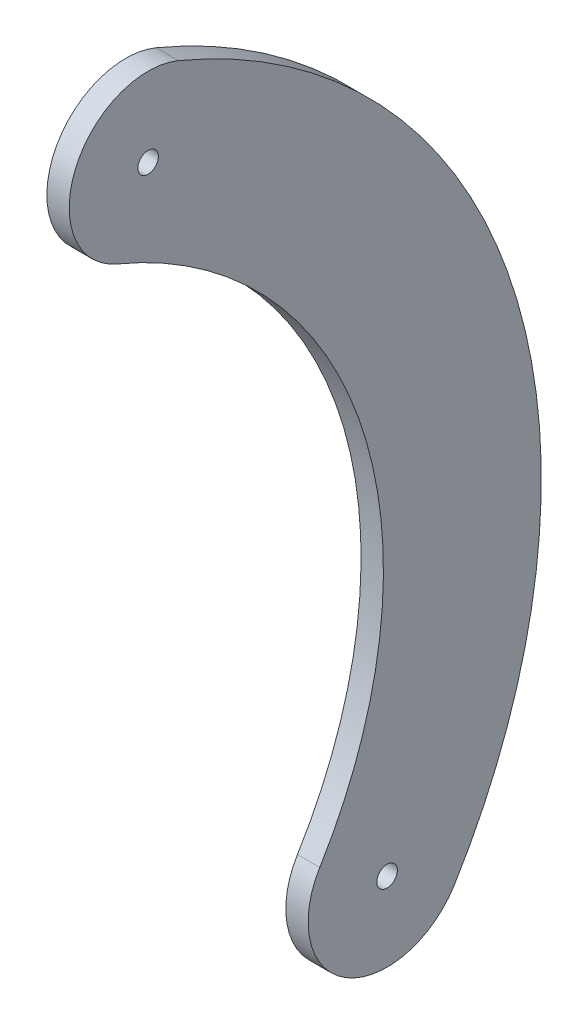
ISO-10303-21;
HEADER;
FILE_DESCRIPTION(('STEP AP214'),'2;1');
FILE_NAME('part.step','',(''),(''),'','','');
FILE_SCHEMA(('AUTOMOTIVE_DESIGN { 1 0 10303 214 1 1 1 1 }'));
ENDSEC;
DATA;
#1=APPLICATION_CONTEXT('core data for automotive mechanical design processes');
#2=APPLICATION_PROTOCOL_DEFINITION('international standard','automotive_design',2000,#1);
#3=PRODUCT_CONTEXT('',#1,'mechanical');
#4=PRODUCT('Part','Part','',(#3));
#5=PRODUCT_RELATED_PRODUCT_CATEGORY('part','',(#4));
#6=PRODUCT_DEFINITION_FORMATION('','',#4);
#7=PRODUCT_DEFINITION_CONTEXT('part definition',#1,'design');
#8=PRODUCT_DEFINITION('design','',#6,#7);
#9=PRODUCT_DEFINITION_SHAPE('','',#8);
#10=(LENGTH_UNIT() NAMED_UNIT(*) SI_UNIT(.MILLI.,.METRE.));
#11=(NAMED_UNIT(*) PLANE_ANGLE_UNIT() SI_UNIT($,.RADIAN.));
#12=(NAMED_UNIT(*) SI_UNIT($,.STERADIAN.) SOLID_ANGLE_UNIT());
#13=UNCERTAINTY_MEASURE_WITH_UNIT(LENGTH_MEASURE(1.E-05),#10,'distance_accuracy_value','');
#14=(GEOMETRIC_REPRESENTATION_CONTEXT(3) GLOBAL_UNCERTAINTY_ASSIGNED_CONTEXT((#13)) GLOBAL_UNIT_ASSIGNED_CONTEXT((#10,
#11,#12)) REPRESENTATION_CONTEXT('',''));
#15=CARTESIAN_POINT('',(0.,0.,0.));
#16=DIRECTION('',(0.,0.,1.));
#17=DIRECTION('',(1.,0.,0.));
#18=AXIS2_PLACEMENT_3D('',#15,#16,#17);
#19=CARTESIAN_POINT('',(5.661,-59.6762715214291,24.8190637650378));
#20=DIRECTION('',(1.,0.,0.));
#21=DIRECTION('',(0.,0.,-1.));
#22=AXIS2_PLACEMENT_3D('',#19,#20,#21);
#23=PLANE('',#22);
#24=CARTESIAN_POINT('',(5.661,93.4694436764184,30.2741737925391));
#25=DIRECTION('',(1.,0.,0.));
#26=DIRECTION('',(0.,0.,-1.));
#27=AXIS2_PLACEMENT_3D('',#24,#25,#26);
#28=CIRCLE('',#27,2.6067);
#29=CARTESIAN_POINT('',(5.661,93.4694436764184,27.6674737925391));
#30=VERTEX_POINT('',#29);
#31=EDGE_CURVE('E108',#30,#30,#28,.T.);
#32=ORIENTED_EDGE('',*,*,#31,.F.);
#33=EDGE_LOOP('',(#32));
#34=FACE_BOUND('',#33,.T.);
#35=CARTESIAN_POINT('',(5.661,-93.4694436764184,-30.2741737925392));
#36=DIRECTION('',(1.,0.,0.));
#37=DIRECTION('',(0.,0.,-1.));
#38=AXIS2_PLACEMENT_3D('',#35,#36,#37);
#39=CIRCLE('',#38,20.);
#40=CARTESIAN_POINT('',(5.661,-83.0122760333025,-13.2257825228688));
#41=VERTEX_POINT('',#40);
#42=CARTESIAN_POINT('',(5.661,-103.926611319534,-47.3225650622094));
#43=VERTEX_POINT('',#42);
#44=EDGE_CURVE('E93',#41,#43,#39,.T.);
#45=ORIENTED_EDGE('',*,*,#44,.T.);
#46=CARTESIAN_POINT('',(5.661,-25.8830993664399,79.9123013226147));
#47=DIRECTION('',(1.,0.,0.));
#48=DIRECTION('',(0.,0.,-1.));
#49=AXIS2_PLACEMENT_3D('',#46,#47,#48);
#50=CIRCLE('',#49,149.263193661186);
#51=CARTESIAN_POINT('',(5.661,111.936037246077,22.5940096059443));
#52=VERTEX_POINT('',#51);
#53=EDGE_CURVE('E88',#43,#52,#50,.T.);
#54=ORIENTED_EDGE('',*,*,#53,.T.);
#55=CARTESIAN_POINT('',(5.661,93.4694436764184,30.2741737925391));
#56=DIRECTION('',(1.,0.,0.));
#57=DIRECTION('',(0.,0.,-1.));
#58=AXIS2_PLACEMENT_3D('',#55,#56,#57);
#59=CIRCLE('',#58,20.);
#60=CARTESIAN_POINT('',(5.661,75.00285010676,37.9543379791339));
#61=VERTEX_POINT('',#60);
#62=EDGE_CURVE('E91',#52,#61,#59,.T.);
#63=ORIENTED_EDGE('',*,*,#62,.T.);
#64=CARTESIAN_POINT('',(5.661,-25.8830993664399,79.9123013226147));
#65=DIRECTION('',(-1.,0.,0.));
#66=DIRECTION('',(0.,0.,-1.));
#67=AXIS2_PLACEMENT_3D('',#64,#65,#66);
#68=CIRCLE('',#67,109.263193661186);
#69=EDGE_CURVE('E58',#61,#41,#68,.T.);
#70=ORIENTED_EDGE('',*,*,#69,.T.);
#71=EDGE_LOOP('',(#45,#54,#63,#70));
#72=FACE_BOUND('',#71,.T.);
#73=CARTESIAN_POINT('',(5.661,-93.4694436764184,-30.2741737925392));
#74=DIRECTION('',(1.,0.,0.));
#75=DIRECTION('',(0.,0.,-1.));
#76=AXIS2_PLACEMENT_3D('',#73,#74,#75);
#77=CIRCLE('',#76,2.6067);
#78=CARTESIAN_POINT('',(5.661,-93.4694436764184,-32.8808737925392));
#79=VERTEX_POINT('',#78);
#80=EDGE_CURVE('E123',#79,#79,#77,.T.);
#81=ORIENTED_EDGE('',*,*,#80,.F.);
#82=EDGE_LOOP('',(#81));
#83=FACE_BOUND('',#82,.T.);
#84=ADVANCED_FACE('F41',(#34,#72,#83),#23,.T.);
#85=CARTESIAN_POINT('',(0.,-59.6762715214291,24.8190637650378));
#86=DIRECTION('',(1.,0.,0.));
#87=DIRECTION('',(0.,0.,-1.));
#88=AXIS2_PLACEMENT_3D('',#85,#86,#87);
#89=PLANE('',#88);
#90=CARTESIAN_POINT('',(0.,-93.4694436764184,-30.2741737925392));
#91=DIRECTION('',(1.,0.,0.));
#92=DIRECTION('',(0.,0.,-1.));
#93=AXIS2_PLACEMENT_3D('',#90,#91,#92);
#94=CIRCLE('',#93,20.);
#95=CARTESIAN_POINT('',(0.,-83.0122760333025,-13.2257825228688));
#96=VERTEX_POINT('',#95);
#97=CARTESIAN_POINT('',(0.,-103.926611319534,-47.3225650622094));
#98=VERTEX_POINT('',#97);
#99=EDGE_CURVE('E105',#96,#98,#94,.T.);
#100=ORIENTED_EDGE('',*,*,#99,.F.);
#101=CARTESIAN_POINT('',(0.,-25.8830993664399,79.9123013226147));
#102=DIRECTION('',(-1.,0.,0.));
#103=DIRECTION('',(0.,0.,-1.));
#104=AXIS2_PLACEMENT_3D('',#101,#102,#103);
#105=CIRCLE('',#104,109.263193661186);
#106=CARTESIAN_POINT('',(0.,75.00285010676,37.9543379791339));
#107=VERTEX_POINT('',#106);
#108=EDGE_CURVE('E81',#107,#96,#105,.T.);
#109=ORIENTED_EDGE('',*,*,#108,.F.);
#110=CARTESIAN_POINT('',(0.,93.4694436764184,30.2741737925391));
#111=DIRECTION('',(1.,0.,0.));
#112=DIRECTION('',(0.,0.,-1.));
#113=AXIS2_PLACEMENT_3D('',#110,#111,#112);
#114=CIRCLE('',#113,20.);
#115=CARTESIAN_POINT('',(0.,111.936037246077,22.5940096059443));
#116=VERTEX_POINT('',#115);
#117=EDGE_CURVE('E75',#116,#107,#114,.T.);
#118=ORIENTED_EDGE('',*,*,#117,.F.);
#119=CARTESIAN_POINT('',(0.,-25.8830993664399,79.9123013226147));
#120=DIRECTION('',(1.,0.,0.));
#121=DIRECTION('',(0.,0.,-1.));
#122=AXIS2_PLACEMENT_3D('',#119,#120,#121);
#123=CIRCLE('',#122,149.263193661186);
#124=EDGE_CURVE('E97',#98,#116,#123,.T.);
#125=ORIENTED_EDGE('',*,*,#124,.F.);
#126=EDGE_LOOP('',(#100,#109,#118,#125));
#127=FACE_BOUND('',#126,.T.);
#128=CARTESIAN_POINT('',(0.,93.4694436764184,30.2741737925391));
#129=DIRECTION('',(1.,0.,0.));
#130=DIRECTION('',(0.,0.,-1.));
#131=AXIS2_PLACEMENT_3D('',#128,#129,#130);
#132=CIRCLE('',#131,2.6067);
#133=CARTESIAN_POINT('',(0.,93.4694436764184,27.6674737925391));
#134=VERTEX_POINT('',#133);
#135=EDGE_CURVE('E120',#134,#134,#132,.T.);
#136=ORIENTED_EDGE('',*,*,#135,.T.);
#137=EDGE_LOOP('',(#136));
#138=FACE_BOUND('',#137,.T.);
#139=CARTESIAN_POINT('',(0.,-93.4694436764184,-30.2741737925392));
#140=DIRECTION('',(1.,0.,0.));
#141=DIRECTION('',(0.,0.,-1.));
#142=AXIS2_PLACEMENT_3D('',#139,#140,#141);
#143=CIRCLE('',#142,2.6067);
#144=CARTESIAN_POINT('',(0.,-93.4694436764184,-32.8808737925392));
#145=VERTEX_POINT('',#144);
#146=EDGE_CURVE('E126',#145,#145,#143,.T.);
#147=ORIENTED_EDGE('',*,*,#146,.T.);
#148=EDGE_LOOP('',(#147));
#149=FACE_BOUND('',#148,.T.);
#150=ADVANCED_FACE('F116',(#127,#138,#149),#89,.F.);
#151=CARTESIAN_POINT('',(5.661,-93.4694436764184,-30.2741737925392));
#152=DIRECTION('',(-1.,0.,0.));
#153=DIRECTION('',(0.,0.,1.));
#154=AXIS2_PLACEMENT_3D('',#151,#152,#153);
#155=CYLINDRICAL_SURFACE('',#154,20.);
#156=ORIENTED_EDGE('',*,*,#99,.T.);
#157=DIRECTION('',(-1.,0.,0.));
#158=VECTOR('',#157,1.);
#159=CARTESIAN_POINT('',(5.661,-103.926611319534,-47.3225650622094));
#160=LINE('',#159,#158);
#161=EDGE_CURVE('E11',#43,#98,#160,.T.);
#162=ORIENTED_EDGE('',*,*,#161,.F.);
#163=ORIENTED_EDGE('',*,*,#44,.F.);
#164=DIRECTION('',(-1.,0.,0.));
#165=VECTOR('',#164,1.);
#166=CARTESIAN_POINT('',(5.661,-83.0122760333025,-13.2257825228688));
#167=LINE('',#166,#165);
#168=EDGE_CURVE('E101',#41,#96,#167,.T.);
#169=ORIENTED_EDGE('',*,*,#168,.T.);
#170=EDGE_LOOP('',(#156,#162,#163,#169));
#171=FACE_BOUND('',#170,.T.);
#172=ADVANCED_FACE('F43',(#171),#155,.T.);
#173=CARTESIAN_POINT('',(5.661,-25.8830993664399,79.9123013226147));
#174=DIRECTION('',(-1.,0.,0.));
#175=DIRECTION('',(0.,0.,1.));
#176=AXIS2_PLACEMENT_3D('',#173,#174,#175);
#177=CYLINDRICAL_SURFACE('',#176,149.263193661186);
#178=ORIENTED_EDGE('',*,*,#124,.T.);
#179=DIRECTION('',(-1.,0.,0.));
#180=VECTOR('',#179,1.);
#181=CARTESIAN_POINT('',(5.661,111.936037246077,22.5940096059443));
#182=LINE('',#181,#180);
#183=EDGE_CURVE('E50',#52,#116,#182,.T.);
#184=ORIENTED_EDGE('',*,*,#183,.F.);
#185=ORIENTED_EDGE('',*,*,#53,.F.);
#186=ORIENTED_EDGE('',*,*,#161,.T.);
#187=EDGE_LOOP('',(#178,#184,#185,#186));
#188=FACE_BOUND('',#187,.T.);
#189=ADVANCED_FACE('F96',(#188),#177,.T.);
#190=CARTESIAN_POINT('',(5.661,93.4694436764184,30.2741737925391));
#191=DIRECTION('',(-1.,0.,0.));
#192=DIRECTION('',(0.,0.,1.));
#193=AXIS2_PLACEMENT_3D('',#190,#191,#192);
#194=CYLINDRICAL_SURFACE('',#193,20.);
#195=ORIENTED_EDGE('',*,*,#117,.T.);
#196=DIRECTION('',(-1.,0.,0.));
#197=VECTOR('',#196,1.);
#198=CARTESIAN_POINT('',(5.661,75.00285010676,37.9543379791339));
#199=LINE('',#198,#197);
#200=EDGE_CURVE('E98',#61,#107,#199,.T.);
#201=ORIENTED_EDGE('',*,*,#200,.F.);
#202=ORIENTED_EDGE('',*,*,#62,.F.);
#203=ORIENTED_EDGE('',*,*,#183,.T.);
#204=EDGE_LOOP('',(#195,#201,#202,#203));
#205=FACE_BOUND('',#204,.T.);
#206=ADVANCED_FACE('F99',(#205),#194,.T.);
#207=CARTESIAN_POINT('',(5.661,-25.8830993664399,79.9123013226147));
#208=DIRECTION('',(-1.,0.,0.));
#209=DIRECTION('',(0.,0.,1.));
#210=AXIS2_PLACEMENT_3D('',#207,#208,#209);
#211=CYLINDRICAL_SURFACE('',#210,109.263193661186);
#212=ORIENTED_EDGE('',*,*,#108,.T.);
#213=ORIENTED_EDGE('',*,*,#168,.F.);
#214=ORIENTED_EDGE('',*,*,#69,.F.);
#215=ORIENTED_EDGE('',*,*,#200,.T.);
#216=EDGE_LOOP('',(#212,#213,#214,#215));
#217=FACE_BOUND('',#216,.T.);
#218=ADVANCED_FACE('F113',(#217),#211,.F.);
#219=CARTESIAN_POINT('',(5.661,93.4694436764184,30.2741737925391));
#220=DIRECTION('',(-1.,0.,0.));
#221=DIRECTION('',(0.,0.,1.));
#222=AXIS2_PLACEMENT_3D('',#219,#220,#221);
#223=CYLINDRICAL_SURFACE('',#222,2.6067);
#224=ORIENTED_EDGE('',*,*,#31,.T.);
#225=EDGE_LOOP('',(#224));
#226=FACE_BOUND('',#225,.T.);
#227=ORIENTED_EDGE('',*,*,#135,.F.);
#228=EDGE_LOOP('',(#227));
#229=FACE_BOUND('',#228,.T.);
#230=ADVANCED_FACE('F143',(#226,#229),#223,.F.);
#231=CARTESIAN_POINT('',(5.661,-93.4694436764184,-30.2741737925392));
#232=DIRECTION('',(-1.,0.,0.));
#233=DIRECTION('',(0.,0.,1.));
#234=AXIS2_PLACEMENT_3D('',#231,#232,#233);
#235=CYLINDRICAL_SURFACE('',#234,2.6067);
#236=ORIENTED_EDGE('',*,*,#80,.T.);
#237=EDGE_LOOP('',(#236));
#238=FACE_BOUND('',#237,.T.);
#239=ORIENTED_EDGE('',*,*,#146,.F.);
#240=EDGE_LOOP('',(#239));
#241=FACE_BOUND('',#240,.T.);
#242=ADVANCED_FACE('F132',(#238,#241),#235,.F.);
#243=CLOSED_SHELL('',(#84,#150,#172,#189,#206,#218,#230,#242));
#244=MANIFOLD_SOLID_BREP('B2',#243);
#245=ADVANCED_BREP_SHAPE_REPRESENTATION('',(#18,#244),#14);
#246=SHAPE_DEFINITION_REPRESENTATION(#9,#245);
ENDSEC;
END-ISO-10303-21;
